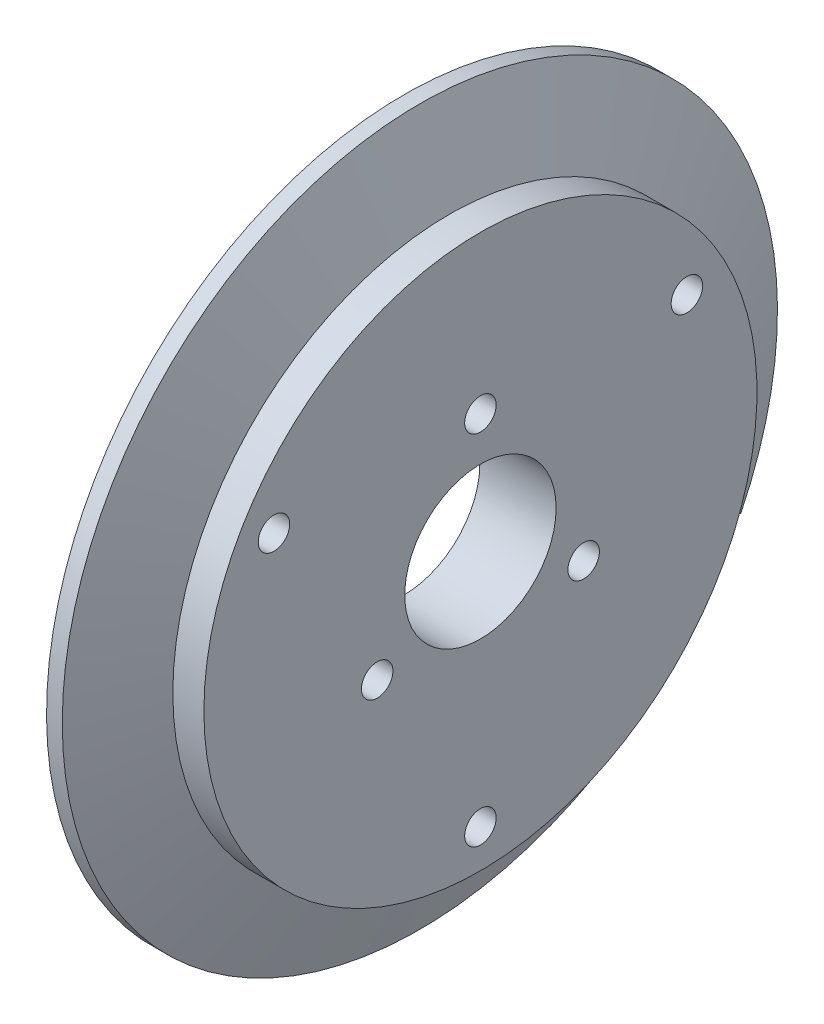
ISO-10303-21;
HEADER;
FILE_DESCRIPTION(('STEP AP214'),'2;1');
FILE_NAME('part.step','',(''),(''),'','','');
FILE_SCHEMA(('AUTOMOTIVE_DESIGN { 1 0 10303 214 1 1 1 1 }'));
ENDSEC;
DATA;
#1=APPLICATION_CONTEXT('core data for automotive mechanical design processes');
#2=APPLICATION_PROTOCOL_DEFINITION('international standard','automotive_design',2000,#1);
#3=PRODUCT_CONTEXT('',#1,'mechanical');
#4=PRODUCT('Part','Part','',(#3));
#5=PRODUCT_RELATED_PRODUCT_CATEGORY('part','',(#4));
#6=PRODUCT_DEFINITION_FORMATION('','',#4);
#7=PRODUCT_DEFINITION_CONTEXT('part definition',#1,'design');
#8=PRODUCT_DEFINITION('design','',#6,#7);
#9=PRODUCT_DEFINITION_SHAPE('','',#8);
#10=(LENGTH_UNIT() NAMED_UNIT(*) SI_UNIT(.MILLI.,.METRE.));
#11=(NAMED_UNIT(*) PLANE_ANGLE_UNIT() SI_UNIT($,.RADIAN.));
#12=(NAMED_UNIT(*) SI_UNIT($,.STERADIAN.) SOLID_ANGLE_UNIT());
#13=UNCERTAINTY_MEASURE_WITH_UNIT(LENGTH_MEASURE(1.E-05),#10,'distance_accuracy_value','');
#14=(GEOMETRIC_REPRESENTATION_CONTEXT(3) GLOBAL_UNCERTAINTY_ASSIGNED_CONTEXT((#13)) GLOBAL_UNIT_ASSIGNED_CONTEXT((#10,
#11,#12)) REPRESENTATION_CONTEXT('',''));
#15=CARTESIAN_POINT('',(0.,0.,0.));
#16=DIRECTION('',(0.,0.,1.));
#17=DIRECTION('',(1.,0.,0.));
#18=AXIS2_PLACEMENT_3D('',#15,#16,#17);
#19=CARTESIAN_POINT('',(0.,0.,0.));
#20=DIRECTION('',(1.,0.,0.));
#21=DIRECTION('',(0.,0.,-1.));
#22=AXIS2_PLACEMENT_3D('',#19,#20,#21);
#23=PLANE('',#22);
#24=CARTESIAN_POINT('',(0.,0.,0.));
#25=DIRECTION('',(1.,0.,0.));
#26=DIRECTION('',(0.,0.,-1.));
#27=AXIS2_PLACEMENT_3D('',#24,#25,#26);
#28=CIRCLE('',#27,7.94);
#29=CARTESIAN_POINT('',(0.,0.,-7.94));
#30=VERTEX_POINT('',#29);
#31=EDGE_CURVE('E144',#30,#30,#28,.T.);
#32=ORIENTED_EDGE('',*,*,#31,.T.);
#33=EDGE_LOOP('',(#32));
#34=FACE_BOUND('',#33,.T.);
#35=CARTESIAN_POINT('',(0.,12.5,0.));
#36=DIRECTION('',(1.,0.,0.));
#37=DIRECTION('',(0.,0.,-1.));
#38=AXIS2_PLACEMENT_3D('',#35,#36,#37);
#39=CIRCLE('',#38,1.65);
#40=CARTESIAN_POINT('',(0.,12.5,-1.65));
#41=VERTEX_POINT('',#40);
#42=EDGE_CURVE('E141',#41,#41,#39,.T.);
#43=ORIENTED_EDGE('',*,*,#42,.T.);
#44=EDGE_LOOP('',(#43));
#45=FACE_BOUND('',#44,.T.);
#46=CARTESIAN_POINT('',(0.,-6.25000000000005,10.8253175473055));
#47=DIRECTION('',(1.,0.,0.));
#48=DIRECTION('',(0.,0.,-1.));
#49=AXIS2_PLACEMENT_3D('',#46,#47,#48);
#50=CIRCLE('',#49,1.65);
#51=CARTESIAN_POINT('',(0.,-6.25000000000005,9.17531754730545));
#52=VERTEX_POINT('',#51);
#53=EDGE_CURVE('E135',#52,#52,#50,.T.);
#54=ORIENTED_EDGE('',*,*,#53,.T.);
#55=EDGE_LOOP('',(#54));
#56=FACE_BOUND('',#55,.T.);
#57=CARTESIAN_POINT('',(0.,-6.25000000000005,-10.8253175473055));
#58=DIRECTION('',(1.,0.,0.));
#59=DIRECTION('',(0.,0.,-1.));
#60=AXIS2_PLACEMENT_3D('',#57,#58,#59);
#61=CIRCLE('',#60,1.65);
#62=CARTESIAN_POINT('',(0.,-6.25000000000005,-12.4753175473055));
#63=VERTEX_POINT('',#62);
#64=EDGE_CURVE('E129',#63,#63,#61,.T.);
#65=ORIENTED_EDGE('',*,*,#64,.T.);
#66=EDGE_LOOP('',(#65));
#67=FACE_BOUND('',#66,.T.);
#68=CARTESIAN_POINT('',(0.,12.4999999999999,21.650635094611));
#69=DIRECTION('',(1.,0.,0.));
#70=DIRECTION('',(0.,0.,-1.));
#71=AXIS2_PLACEMENT_3D('',#68,#69,#70);
#72=CIRCLE('',#71,1.64999999999999);
#73=CARTESIAN_POINT('',(0.,12.4999999999999,20.000635094611));
#74=VERTEX_POINT('',#73);
#75=EDGE_CURVE('E123',#74,#74,#72,.T.);
#76=ORIENTED_EDGE('',*,*,#75,.T.);
#77=EDGE_LOOP('',(#76));
#78=FACE_BOUND('',#77,.T.);
#79=CARTESIAN_POINT('',(0.,12.5,-21.650635094611));
#80=DIRECTION('',(1.,0.,0.));
#81=DIRECTION('',(0.,0.,-1.));
#82=AXIS2_PLACEMENT_3D('',#79,#80,#81);
#83=CIRCLE('',#82,1.65000000000001);
#84=CARTESIAN_POINT('',(0.,12.5,-23.300635094611));
#85=VERTEX_POINT('',#84);
#86=EDGE_CURVE('E117',#85,#85,#83,.T.);
#87=ORIENTED_EDGE('',*,*,#86,.T.);
#88=EDGE_LOOP('',(#87));
#89=FACE_BOUND('',#88,.T.);
#90=CARTESIAN_POINT('',(0.,-25.,0.));
#91=DIRECTION('',(1.,0.,0.));
#92=DIRECTION('',(0.,0.,-1.));
#93=AXIS2_PLACEMENT_3D('',#90,#91,#92);
#94=CIRCLE('',#93,1.65);
#95=CARTESIAN_POINT('',(0.,-25.,-1.65));
#96=VERTEX_POINT('',#95);
#97=EDGE_CURVE('E111',#96,#96,#94,.T.);
#98=ORIENTED_EDGE('',*,*,#97,.T.);
#99=EDGE_LOOP('',(#98));
#100=FACE_BOUND('',#99,.T.);
#101=DIRECTION('',(0.,0.499999999999998,0.86602540378444));
#102=VECTOR('',#101,1.);
#103=CARTESIAN_POINT('',(0.,-40.5349364905387,-75.2085694831912));
#104=LINE('',#103,#102);
#105=CARTESIAN_POINT('',(0.,-16.5432234244085,-33.6537034920393));
#106=VERTEX_POINT('',#105);
#107=CARTESIAN_POINT('',(0.,-7.83493649053886,-18.5705080756888));
#108=VERTEX_POINT('',#107);
#109=EDGE_CURVE('E84',#106,#108,#104,.T.);
#110=ORIENTED_EDGE('',*,*,#109,.T.);
#111=DIRECTION('',(0.,0.86602540378444,-0.499999999999998));
#112=VECTOR('',#111,1.);
#113=CARTESIAN_POINT('',(0.,-12.1650635094611,-16.0705080756888));
#114=LINE('',#113,#112);
#115=CARTESIAN_POINT('',(0.,-12.1650635094611,-16.0705080756888));
#116=VERTEX_POINT('',#115);
#117=EDGE_CURVE('E91',#116,#108,#114,.T.);
#118=ORIENTED_EDGE('',*,*,#117,.F.);
#119=DIRECTION('',(0.,0.499999999999998,0.86602540378444));
#120=VECTOR('',#119,1.);
#121=CARTESIAN_POINT('',(0.,-44.8650635094609,-72.7085694831912));
#122=LINE('',#121,#120);
#123=CARTESIAN_POINT('',(0.,-20.8733504433307,-31.1537034920394));
#124=VERTEX_POINT('',#123);
#125=EDGE_CURVE('E271',#124,#116,#122,.T.);
#126=ORIENTED_EDGE('',*,*,#125,.F.);
#127=CARTESIAN_POINT('',(0.,0.,0.));
#128=DIRECTION('',(-1.,0.,0.));
#129=DIRECTION('',(0.,0.,1.));
#130=AXIS2_PLACEMENT_3D('',#127,#128,#129);
#131=CIRCLE('',#130,37.5);
#132=EDGE_CURVE('E102',#124,#106,#131,.T.);
#133=ORIENTED_EDGE('',*,*,#132,.T.);
#134=EDGE_LOOP('',(#110,#118,#126,#133));
#135=FACE_BOUND('',#134,.T.);
#136=ADVANCED_FACE('F32',(#34,#45,#56,#67,#78,#89,#100,#135),#23,.F.);
#137=CARTESIAN_POINT('',(0.,0.,0.));
#138=DIRECTION('',(-1.,0.,0.));
#139=DIRECTION('',(0.,0.,1.));
#140=AXIS2_PLACEMENT_3D('',#137,#138,#139);
#141=CYLINDRICAL_SURFACE('',#140,37.5);
#142=DIRECTION('',(-1.,0.,0.));
#143=VECTOR('',#142,1.);
#144=CARTESIAN_POINT('',(0.,-16.5432234244085,-33.6537034920393));
#145=LINE('',#144,#143);
#146=CARTESIAN_POINT('',(1.65,-16.5432234244085,-33.6537034920393));
#147=VERTEX_POINT('',#146);
#148=EDGE_CURVE('E58',#106,#147,#145,.F.);
#149=ORIENTED_EDGE('',*,*,#148,.F.);
#150=ORIENTED_EDGE('',*,*,#132,.F.);
#151=DIRECTION('',(-1.,0.,0.));
#152=VECTOR('',#151,1.);
#153=CARTESIAN_POINT('',(0.,-20.8733504433307,-31.1537034920394));
#154=LINE('',#153,#152);
#155=CARTESIAN_POINT('',(1.65,-20.8733504433307,-31.1537034920394));
#156=VERTEX_POINT('',#155);
#157=EDGE_CURVE('E103',#156,#124,#154,.T.);
#158=ORIENTED_EDGE('',*,*,#157,.F.);
#159=CARTESIAN_POINT('',(1.65,0.,0.));
#160=DIRECTION('',(-1.,0.,0.));
#161=DIRECTION('',(0.,0.,1.));
#162=AXIS2_PLACEMENT_3D('',#159,#160,#161);
#163=CIRCLE('',#162,37.5);
#164=EDGE_CURVE('E158',#156,#147,#163,.T.);
#165=ORIENTED_EDGE('',*,*,#164,.T.);
#166=EDGE_LOOP('',(#149,#150,#158,#165));
#167=FACE_BOUND('',#166,.T.);
#168=ADVANCED_FACE('F220',(#167),#141,.T.);
#169=CARTESIAN_POINT('',(4.74374699126273,0.,0.));
#170=DIRECTION('',(-1.,0.,0.));
#171=DIRECTION('',(0.,0.,1.));
#172=AXIS2_PLACEMENT_3D('',#169,#170,#171);
#173=CONICAL_SURFACE('',#172,29.,1.22173047639603);
#174=CARTESIAN_POINT('',(4.74374699126273,0.,0.));
#175=DIRECTION('',(-1.,0.,0.));
#176=DIRECTION('',(0.,0.,1.));
#177=AXIS2_PLACEMENT_3D('',#174,#175,#176);
#178=CIRCLE('',#177,29.);
#179=CARTESIAN_POINT('',(4.74374699126273,0.,29.));
#180=VERTEX_POINT('',#179);
#181=EDGE_CURVE('E155',#180,#180,#178,.T.);
#182=ORIENTED_EDGE('',*,*,#181,.T.);
#183=EDGE_LOOP('',(#182));
#184=FACE_BOUND('',#183,.T.);
#185=CARTESIAN_POINT('',(-8.8275723793234,-30.9548030849081,-58.6152916813509));
#186=CARTESIAN_POINT('',(-8.31446972955865,-30.2494314987137,-57.3935522558468));
#187=CARTESIAN_POINT('',(-7.80138672173942,-29.5440563402964,-56.1718066430711));
#188=CARTESIAN_POINT('',(-6.77526066960312,-28.133282469021,-53.7282746200315));
#189=CARTESIAN_POINT('',(-6.26221762631444,-27.427883755976,-52.5064882094438));
#190=CARTESIAN_POINT('',(-5.23365679063651,-26.0135876322605,-50.0568554662208));
#191=CARTESIAN_POINT('',(-4.71813930340929,-25.3046901661063,-48.8290090374849));
#192=CARTESIAN_POINT('',(-3.68719321070832,-23.8868954942907,-46.3733166311998));
#193=CARTESIAN_POINT('',(-3.17176460363213,-23.1779982889206,-45.1454706541552));
#194=CARTESIAN_POINT('',(-2.09033687634009,-21.6904879643889,-42.569027195283));
#195=CARTESIAN_POINT('',(-1.52434808066987,-20.9118729686823,-41.2204264631841));
#196=CARTESIAN_POINT('',(-0.392496825408512,-19.3545641044236,-38.5230883872106));
#197=CARTESIAN_POINT('',(0.173365623890607,-18.5758702340013,-37.1743510400968));
#198=CARTESIAN_POINT('',(1.30195389490881,-17.0224485071333,-34.48374568358));
#199=CARTESIAN_POINT('',(1.86468087393878,-16.2477208609,-33.1418780382757));
#200=CARTESIAN_POINT('',(2.98968130018019,-14.6983890380062,-30.4583566032404));
#201=CARTESIAN_POINT('',(3.5519548228383,-13.9237848750427,-29.1167028372331));
#202=CARTESIAN_POINT('',(4.59290286817615,-12.4890390951529,-26.6316502505189));
#203=CARTESIAN_POINT('',(5.07164433984478,-11.8289096233568,-25.4882724657945));
#204=CARTESIAN_POINT('',(6.02898525084169,-10.5080070416188,-23.2004020823754));
#205=CARTESIAN_POINT('',(6.50758424499138,-9.84723385101026,-22.055909343962));
#206=CARTESIAN_POINT('',(7.47180627175397,-8.5146487896143,-19.7478043122169));
#207=CARTESIAN_POINT('',(7.9574151609319,-7.84283435879329,-18.584187584777));
#208=CARTESIAN_POINT('',(8.6839159015045,-6.8358982701514,-16.8401231192745));
#209=CARTESIAN_POINT('',(8.92540434057852,-6.50088424168883,-16.259861800729));
#210=CARTESIAN_POINT('',(9.40779440466214,-5.83079084317275,-15.0992259886827));
#211=CARTESIAN_POINT('',(9.64869608941121,-5.49571148387354,-14.5188515138088));
#212=CARTESIAN_POINT('',(10.113591811622,-4.84783679275167,-13.3966996318477));
#213=CARTESIAN_POINT('',(10.3376384134174,-4.53505089620791,-12.8549385671429));
#214=CARTESIAN_POINT('',(10.7847616764036,-3.90916882746776,-11.7708790245387));
#215=CARTESIAN_POINT('',(11.007837927177,-3.59607258195171,-11.2285804196458));
#216=CARTESIAN_POINT('',(11.4549169044161,-2.96596104454716,-10.1371952224258));
#217=CARTESIAN_POINT('',(11.6789004599262,-2.6489423440398,-9.58810272619759));
#218=CARTESIAN_POINT('',(12.0125124680909,-2.17325577179811,-8.76418941459669));
#219=CARTESIAN_POINT('',(12.1232436667838,-2.01478137485388,-8.48970370739045));
#220=CARTESIAN_POINT('',(12.3436899817237,-1.6976561496558,-7.94042670498564));
#221=CARTESIAN_POINT('',(12.4534050998511,-1.53900532172906,-7.66563541035366));
#222=CARTESIAN_POINT('',(12.667346255247,-1.22737502023325,-7.1258758949849));
#223=CARTESIAN_POINT('',(12.7716244824056,-1.07440452232944,-6.86092322055641));
#224=CARTESIAN_POINT('',(12.9782643988866,-0.768138223713688,-6.33045443070786));
#225=CARTESIAN_POINT('',(13.0806260703921,-0.614842419992336,-6.06493831007536));
#226=CARTESIAN_POINT('',(13.2830281548528,-0.306928673309447,-5.5316160564717));
#227=CARTESIAN_POINT('',(13.3830526750399,-0.152308098896462,-5.26380536569294));
#228=CARTESIAN_POINT('',(13.5295602595354,0.0801800804788776,-4.86112402685566));
#229=CARTESIAN_POINT('',(13.5778080505104,0.157769242283406,-4.72673565649353));
#230=CARTESIAN_POINT('',(13.6727604340594,0.313182827408092,-4.45755143087114));
#231=CARTESIAN_POINT('',(13.7194650492743,0.391007247258334,-4.32275558162095));
#232=CARTESIAN_POINT('',(13.8098198251066,0.545198731008753,-4.05568809767079));
#233=CARTESIAN_POINT('',(13.8535150783767,0.621559161806611,-3.92342795184106));
#234=CARTESIAN_POINT('',(13.9383335551399,0.774639263549616,-3.65828543799436));
#235=CARTESIAN_POINT('',(13.9794567554884,0.851358937720731,-3.52540306438986));
#236=CARTESIAN_POINT('',(14.05827404238,1.00530204011147,-3.25876578957431));
#237=CARTESIAN_POINT('',(14.0959655623124,1.08252579982915,-3.12501031419178));
#238=CARTESIAN_POINT('',(14.1666627993073,1.23751735452384,-2.8565570667165));
#239=CARTESIAN_POINT('',(14.1996683862727,1.3152851645426,-2.72185926857065));
#240=CARTESIAN_POINT('',(14.2591023952407,1.47071480116494,-2.4526472409388));
#241=CARTESIAN_POINT('',(14.2855886762605,1.54837098883087,-2.31814277837928));
#242=CARTESIAN_POINT('',(14.3305004797512,1.7042762203737,-2.04810699618131));
#243=CARTESIAN_POINT('',(14.3489264883255,1.78252522820885,-1.91257573896899));
#244=CARTESIAN_POINT('',(14.3758908922447,1.93929115621144,-1.64104918677281));
#245=CARTESIAN_POINT('',(14.3844505451758,2.0178071334553,-1.50505552498053));
#246=CARTESIAN_POINT('',(14.3907199696699,2.17493404092078,-1.23290373801414));
#247=CARTESIAN_POINT('',(14.3884333670067,2.25354493063018,-1.09674568300925));
#248=CARTESIAN_POINT('',(14.3788053987816,2.35354341300161,-0.923543230862164));
#249=CARTESIAN_POINT('',(14.3763350898824,2.37506779755481,-0.886261903214368));
#250=CARTESIAN_POINT('',(14.3706291339643,2.41810238278785,-0.811723815108104));
#251=CARTESIAN_POINT('',(14.3673931109524,2.43961257127687,-0.774467075764735));
#252=CARTESIAN_POINT('',(14.3565678253939,2.50414014951856,-0.662702031760737));
#253=CARTESIAN_POINT('',(14.3478655796217,2.54711161453185,-0.58827327108204));
#254=CARTESIAN_POINT('',(14.3277568715979,2.63294075447817,-0.439612839925074));
#255=CARTESIAN_POINT('',(14.3163475021519,2.67579825664283,-0.365381468690391));
#256=CARTESIAN_POINT('',(14.2911403727055,2.7613226519318,-0.217248870763302));
#257=CARTESIAN_POINT('',(14.277343323735,2.80398959793288,-0.143347552485642));
#258=CARTESIAN_POINT('',(14.2327860184206,2.93187316308032,0.0781532798027739));
#259=CARTESIAN_POINT('',(14.1988981125224,3.01681769695388,0.225281528297036));
#260=CARTESIAN_POINT('',(14.1250545968029,3.18602091579569,0.518350100135264));
#261=CARTESIAN_POINT('',(14.0850994001906,3.27027964705868,0.664290503664059));
#262=CARTESIAN_POINT('',(14.000616966875,3.4386547469455,0.955924731397503));
#263=CARTESIAN_POINT('',(13.956068350571,3.52276840975568,1.10161386899545));
#264=CARTESIAN_POINT('',(13.8637887458833,3.69055057206556,1.39222109871994));
#265=CARTESIAN_POINT('',(13.8160578934683,3.77421909042039,1.53713922350453));
#266=CARTESIAN_POINT('',(13.7183665120087,3.94105573579508,1.82610876985785));
#267=CARTESIAN_POINT('',(13.6684103856478,4.02422451105977,1.97016131421955));
#268=CARTESIAN_POINT('',(13.5667401422727,4.19028932126195,2.25779400283899));
#269=CARTESIAN_POINT('',(13.5150261065334,4.27318536861486,2.40137416860086));
#270=CARTESIAN_POINT('',(13.462708598093,4.35598284570649,2.54478360566209));
#271=B_SPLINE_CURVE_WITH_KNOTS('',3,(#185,#186,#187,#188,#189,#190,#191,#192,#193,#194,#195,
#196,#197,#198,#199,#200,#201,#202,#203,#204,#205,#206,#207,#208,#209,#210,#211,#212,#213,#214,
#215,#216,#217,#218,#219,#220,#221,#222,#223,#224,#225,#226,#227,#228,#229,#230,#231,#232,#233,
#234,#235,#236,#237,#238,#239,#240,#241,#242,#243,#244,#245,#246,#247,#248,#249,#250,#251,#252,
#253,#254,#255,#256,#257,#258,#259,#260,#261,#262,#263,#264,#265,#266,#267,#268,#269,#270),
.UNSPECIFIED.,.F.,.F.,(4,2,2,2,2,2,2,2,2,2,2,2,2,2,2,2,2,2,2,2,2,2,2,2,2,2,2,2,2,2,2,2,2,2,2,2,
2,2,2,2,2,2,4),(0.,4.50346929079899,9.00703042243521,13.5328570574977,18.0585911124506,
23.0292829156109,28.0002900431737,32.9457182322975,37.8899857278246,42.1031191157398,
46.3197380851206,50.6058067730177,52.7424601458648,54.8788860337746,56.8723327328204,
58.866553501968,60.8838606779495,61.8910642282244,62.8982659141455,63.867933669739,
64.837610435213,65.8126286922797,66.3001405219645,66.7876451958876,67.2641750572769,
67.7407092060907,68.2175968841525,68.6944977996013,69.166999826173,69.6394733529036,
70.1109269962865,70.5822230494509,70.7115784885882,70.840997578151,71.1000935476051,
71.3594690310833,71.6187674073162,72.1382990556333,72.6577953374347,73.1798291902141,
73.7018407521282,74.2228617934228,74.7438587786185),.UNSPECIFIED.);
#272=CARTESIAN_POINT('',(2.,-16.0613145260962,-32.8190127955428));
#273=VERTEX_POINT('',#272);
#274=EDGE_CURVE('E11',#147,#273,#271,.T.);
#275=ORIENTED_EDGE('',*,*,#274,.F.);
#276=ORIENTED_EDGE('',*,*,#164,.F.);
#277=CARTESIAN_POINT('',(13.8800327516613,-0.669533486915,3.84033398329447));
#278=CARTESIAN_POINT('',(13.9181248466515,-0.737798323284927,3.72209581833139));
#279=CARTESIAN_POINT('',(13.9552895025572,-0.80620019842367,3.60362029525811));
#280=CARTESIAN_POINT('',(14.0270299357118,-0.943377513899891,3.36602221520738));
#281=CARTESIAN_POINT('',(14.0616044200523,-1.01215312266068,3.24689936651221));
#282=CARTESIAN_POINT('',(14.1276572444872,-1.15066764122823,3.00698518276726));
#283=CARTESIAN_POINT('',(14.1591082853087,-1.22040984337177,2.88618814522291));
#284=CARTESIAN_POINT('',(14.2175167796332,-1.36036152577541,2.64378472069506));
#285=CARTESIAN_POINT('',(14.244474734636,-1.43057095297485,2.52217842561533));
#286=CARTESIAN_POINT('',(14.2915938132783,-1.56855397592199,2.28318481928894));
#287=CARTESIAN_POINT('',(14.3119915282593,-1.63630702899612,2.16583308899664));
#288=CARTESIAN_POINT('',(14.3462114263407,-1.77223417961751,1.9304003579923));
#289=CARTESIAN_POINT('',(14.3600338721431,-1.84040826023319,1.81231938660664));
#290=CARTESIAN_POINT('',(14.3799655995868,-1.9767342937995,1.57619577007546));
#291=CARTESIAN_POINT('',(14.3861096045952,-2.0448849427797,1.45815538347298));
#292=CARTESIAN_POINT('',(14.3902328252852,-2.18124310927479,1.22197611107655));
#293=CARTESIAN_POINT('',(14.3882129649864,-2.24945061948024,1.10383723794292));
#294=CARTESIAN_POINT('',(14.3770145348056,-2.37654677177008,0.883700244730416));
#295=CARTESIAN_POINT('',(14.3688323049525,-2.43545847138552,0.781662187836234));
#296=CARTESIAN_POINT('',(14.3470371955009,-2.55303496835207,0.578013721314203));
#297=CARTESIAN_POINT('',(14.3334235034022,-2.61169972743557,0.476403377967799));
#298=CARTESIAN_POINT('',(14.3014992394545,-2.72875727861502,0.273653751915405));
#299=CARTESIAN_POINT('',(14.283184441827,-2.78714977764509,0.172514976814394));
#300=CARTESIAN_POINT('',(14.2426658648409,-2.90359096094978,-0.0291670687627775));
#301=CARTESIAN_POINT('',(14.2204621613076,-2.9616396519051,-0.129710350810261));
#302=CARTESIAN_POINT('',(14.1727471613154,-3.07779531224786,-0.330897856110649));
#303=CARTESIAN_POINT('',(14.1472148581922,-3.13590010376929,-0.431538307188945));
#304=CARTESIAN_POINT('',(14.0935910598118,-3.25181509458673,-0.632308960643642));
#305=CARTESIAN_POINT('',(14.0654994067331,-3.30962527548325,-0.732439131151149));
#306=CARTESIAN_POINT('',(13.9782183430565,-3.48261937915603,-1.03207370812225));
#307=CARTESIAN_POINT('',(13.9159999470235,-3.59741999692224,-1.23091421083363));
#308=CARTESIAN_POINT('',(13.7848778960361,-3.82899111203192,-1.63200714776898));
#309=CARTESIAN_POINT('',(13.7158507307617,-3.94574379723715,-1.83422873046453));
#310=CARTESIAN_POINT('',(13.5742365026275,-4.17871094356853,-2.23773966440481));
#311=CARTESIAN_POINT('',(13.5016492919662,-4.29492538212886,-2.43902897656438));
#312=CARTESIAN_POINT('',(13.3543248860135,-4.52654146623915,-2.84019980209357));
#313=CARTESIAN_POINT('',(13.2795965593017,-4.64194452945183,-3.040083770927));
#314=CARTESIAN_POINT('',(13.1284433415423,-4.87246920096191,-3.4393642143806));
#315=CARTESIAN_POINT('',(13.0520184862204,-4.98759081512952,-3.63876069916824));
#316=CARTESIAN_POINT('',(12.8848632077371,-5.2371448700918,-4.07100100159774));
#317=CARTESIAN_POINT('',(12.7939059135439,-5.37153925567983,-4.30377890568821));
#318=CARTESIAN_POINT('',(12.6107875321295,-5.64012304230343,-4.76897967020953));
#319=CARTESIAN_POINT('',(12.5186264402424,-5.77431244254226,-5.00140252926038));
#320=CARTESIAN_POINT('',(12.2408329603037,-6.17665823066907,-5.69828587650737));
#321=CARTESIAN_POINT('',(12.0538927438792,-6.44458869087177,-6.16235504647373));
#322=CARTESIAN_POINT('',(11.6779948685343,-6.98010871885599,-7.08990294341312));
#323=CARTESIAN_POINT('',(11.4890371139566,-7.24769826979469,-7.5533816412135));
#324=CARTESIAN_POINT('',(11.1098378652987,-7.7826474076143,-8.47994072738224));
#325=CARTESIAN_POINT('',(10.9195963813569,-8.05000699629261,-8.94302111886377));
#326=CARTESIAN_POINT('',(10.5379823048394,-8.58495419555034,-9.86957684734486));
#327=CARTESIAN_POINT('',(10.3466084856771,-8.85254158718603,-10.3330518051227));
#328=CARTESIAN_POINT('',(9.96325269692037,-9.38760800702452,-11.259814029707));
#329=CARTESIAN_POINT('',(9.77127072611891,-9.65508703501107,-11.7231012961388));
#330=CARTESIAN_POINT('',(9.19468278416125,-10.4573932592544,-13.1127364397571));
#331=CARTESIAN_POINT('',(8.80942497559308,-10.9921033131635,-14.0388814204454));
#332=CARTESIAN_POINT('',(8.04419651514756,-12.0526459755696,-15.8757951953273));
#333=CARTESIAN_POINT('',(7.66424183126965,-12.5784814668409,-16.786568982632));
#334=CARTESIAN_POINT('',(6.90371539865151,-13.6300448142867,-18.6079301277855));
#335=CARTESIAN_POINT('',(6.52314364583321,-14.1557726697239,-19.5185174843569));
#336=CARTESIAN_POINT('',(5.7617504253982,-15.2069299665951,-21.3391753292846));
#337=CARTESIAN_POINT('',(5.38092913308989,-15.7323594397816,-22.2492458726377));
#338=CARTESIAN_POINT('',(4.61899644144797,-16.7831646656706,-24.0692939127364));
#339=CARTESIAN_POINT('',(4.23788504266621,-17.3085404184733,-24.9792714096553));
#340=CARTESIAN_POINT('',(3.31191595989788,-18.584622268314,-27.1895100081959));
#341=CARTESIAN_POINT('',(2.76694833458527,-19.3353084198965,-28.4897365632752));
#342=CARTESIAN_POINT('',(1.67672401679049,-20.836628732149,-31.0900996225318));
#343=CARTESIAN_POINT('',(1.13146732414082,-21.5872628927887,-32.3902361266566));
#344=CARTESIAN_POINT('',(-0.504775067040297,-23.8393476618993,-36.2909613697081));
#345=CARTESIAN_POINT('',(-1.59606114071008,-25.3407437092891,-38.8914556060703));
#346=CARTESIAN_POINT('',(-3.80133020586414,-28.3740882577174,-44.1453624808103));
#347=CARTESIAN_POINT('',(-4.91532202645193,-29.9060351538043,-46.7987723393302));
#348=CARTESIAN_POINT('',(-7.14341521438626,-32.9696308045292,-52.1050756602329));
#349=CARTESIAN_POINT('',(-8.25751653549719,-34.5012795675736,-54.7579691371758));
#350=CARTESIAN_POINT('',(-9.37168308539007,-36.032916463105,-57.4108420589833));
#351=B_SPLINE_CURVE_WITH_KNOTS('',3,(#277,#278,#279,#280,#281,#282,#283,#284,#285,#286,#287,
#288,#289,#290,#291,#292,#293,#294,#295,#296,#297,#298,#299,#300,#301,#302,#303,#304,#305,#306,
#307,#308,#309,#310,#311,#312,#313,#314,#315,#316,#317,#318,#319,#320,#321,#322,#323,#324,#325,
#326,#327,#328,#329,#330,#331,#332,#333,#334,#335,#336,#337,#338,#339,#340,#341,#342,#343,#344,
#345,#346,#347,#348,#349,#350),.UNSPECIFIED.,.F.,.F.,(4,2,2,2,2,2,2,2,2,2,2,2,2,2,2,2,2,2,2,2,2,
2,2,2,2,2,2,2,2,2,2,2,2,2,2,2,4),(0.,0.425250957693079,0.850712788289778,1.27961528193183,
1.70846987113711,2.11943741544868,2.53038853897442,2.93947445866464,3.34851407762963,
3.70269966118618,4.05693824774556,4.41149637791795,4.76604759574029,5.12295576405377,
5.47988595593766,6.19342044382983,6.92386897170938,7.65434785113274,8.38214574612995,
9.10992832963055,9.96120898364911,10.8124929380923,12.5150831089088,14.2177543661351,
15.9204121920311,17.6254993889332,19.3305899720289,22.7406837328013,26.0952918215277,
29.449922171186,32.8031242359375,36.1563199379115,40.947976863231,45.7396365682249,
55.3244677850603,65.1048464225764,74.8836562176292),.UNSPECIFIED.);
#352=CARTESIAN_POINT('',(2.,-20.3914415450184,-30.3190127955428));
#353=VERTEX_POINT('',#352);
#354=EDGE_CURVE('E162',#353,#156,#351,.T.);
#355=ORIENTED_EDGE('',*,*,#354,.F.);
#356=CARTESIAN_POINT('',(2.,0.,0.));
#357=DIRECTION('',(-1.,0.,0.));
#358=DIRECTION('',(0.,0.,1.));
#359=AXIS2_PLACEMENT_3D('',#356,#357,#358);
#360=CIRCLE('',#359,36.5383829031909);
#361=EDGE_CURVE('E44',#273,#353,#360,.T.);
#362=ORIENTED_EDGE('',*,*,#361,.F.);
#363=EDGE_LOOP('',(#275,#276,#355,#362));
#364=FACE_BOUND('',#363,.T.);
#365=ADVANCED_FACE('F167',(#184,#364),#173,.T.);
#366=CARTESIAN_POINT('',(8.,29.,0.));
#367=DIRECTION('',(-1.,0.,0.));
#368=DIRECTION('',(0.,0.,1.));
#369=AXIS2_PLACEMENT_3D('',#366,#367,#368);
#370=PLANE('',#369);
#371=CARTESIAN_POINT('',(8.,-25.,0.));
#372=DIRECTION('',(1.,0.,0.));
#373=DIRECTION('',(0.,0.,-1.));
#374=AXIS2_PLACEMENT_3D('',#371,#372,#373);
#375=CIRCLE('',#374,1.65);
#376=CARTESIAN_POINT('',(8.,-25.,-1.65));
#377=VERTEX_POINT('',#376);
#378=EDGE_CURVE('E110',#377,#377,#375,.T.);
#379=ORIENTED_EDGE('',*,*,#378,.F.);
#380=EDGE_LOOP('',(#379));
#381=FACE_BOUND('',#380,.T.);
#382=CARTESIAN_POINT('',(8.,12.5,-21.650635094611));
#383=DIRECTION('',(1.,0.,0.));
#384=DIRECTION('',(0.,0.,-1.));
#385=AXIS2_PLACEMENT_3D('',#382,#383,#384);
#386=CIRCLE('',#385,1.65000000000001);
#387=CARTESIAN_POINT('',(8.,12.5,-23.300635094611));
#388=VERTEX_POINT('',#387);
#389=EDGE_CURVE('E114',#388,#388,#386,.T.);
#390=ORIENTED_EDGE('',*,*,#389,.F.);
#391=EDGE_LOOP('',(#390));
#392=FACE_BOUND('',#391,.T.);
#393=CARTESIAN_POINT('',(8.,12.4999999999999,21.650635094611));
#394=DIRECTION('',(1.,0.,0.));
#395=DIRECTION('',(0.,0.,-1.));
#396=AXIS2_PLACEMENT_3D('',#393,#394,#395);
#397=CIRCLE('',#396,1.64999999999999);
#398=CARTESIAN_POINT('',(8.,12.4999999999999,20.000635094611));
#399=VERTEX_POINT('',#398);
#400=EDGE_CURVE('E120',#399,#399,#397,.T.);
#401=ORIENTED_EDGE('',*,*,#400,.F.);
#402=EDGE_LOOP('',(#401));
#403=FACE_BOUND('',#402,.T.);
#404=CARTESIAN_POINT('',(8.,-6.25000000000005,-10.8253175473055));
#405=DIRECTION('',(1.,0.,0.));
#406=DIRECTION('',(0.,0.,-1.));
#407=AXIS2_PLACEMENT_3D('',#404,#405,#406);
#408=CIRCLE('',#407,1.65);
#409=CARTESIAN_POINT('',(8.,-6.25000000000005,-12.4753175473055));
#410=VERTEX_POINT('',#409);
#411=EDGE_CURVE('E126',#410,#410,#408,.T.);
#412=ORIENTED_EDGE('',*,*,#411,.F.);
#413=EDGE_LOOP('',(#412));
#414=FACE_BOUND('',#413,.T.);
#415=CARTESIAN_POINT('',(8.,-6.25000000000005,10.8253175473055));
#416=DIRECTION('',(1.,0.,0.));
#417=DIRECTION('',(0.,0.,-1.));
#418=AXIS2_PLACEMENT_3D('',#415,#416,#417);
#419=CIRCLE('',#418,1.65);
#420=CARTESIAN_POINT('',(8.,-6.25000000000005,9.17531754730545));
#421=VERTEX_POINT('',#420);
#422=EDGE_CURVE('E132',#421,#421,#419,.T.);
#423=ORIENTED_EDGE('',*,*,#422,.F.);
#424=EDGE_LOOP('',(#423));
#425=FACE_BOUND('',#424,.T.);
#426=CARTESIAN_POINT('',(8.,12.5,0.));
#427=DIRECTION('',(1.,0.,0.));
#428=DIRECTION('',(0.,0.,-1.));
#429=AXIS2_PLACEMENT_3D('',#426,#427,#428);
#430=CIRCLE('',#429,1.65);
#431=CARTESIAN_POINT('',(8.,12.5,-1.65));
#432=VERTEX_POINT('',#431);
#433=EDGE_CURVE('E138',#432,#432,#430,.T.);
#434=ORIENTED_EDGE('',*,*,#433,.F.);
#435=EDGE_LOOP('',(#434));
#436=FACE_BOUND('',#435,.T.);
#437=CARTESIAN_POINT('',(7.99999999999999,0.,0.));
#438=DIRECTION('',(-1.,0.,0.));
#439=DIRECTION('',(0.,0.,1.));
#440=AXIS2_PLACEMENT_3D('',#437,#438,#439);
#441=CIRCLE('',#440,29.);
#442=CARTESIAN_POINT('',(7.99999999999999,0.,29.));
#443=VERTEX_POINT('',#442);
#444=EDGE_CURVE('E150',#443,#443,#441,.T.);
#445=ORIENTED_EDGE('',*,*,#444,.F.);
#446=EDGE_LOOP('',(#445));
#447=FACE_BOUND('',#446,.T.);
#448=CARTESIAN_POINT('',(7.99999999999999,0.,0.));
#449=DIRECTION('',(1.,0.,0.));
#450=DIRECTION('',(0.,0.,-1.));
#451=AXIS2_PLACEMENT_3D('',#448,#449,#450);
#452=CIRCLE('',#451,7.94);
#453=CARTESIAN_POINT('',(7.99999999999999,0.,-7.94));
#454=VERTEX_POINT('',#453);
#455=EDGE_CURVE('E147',#454,#454,#452,.T.);
#456=ORIENTED_EDGE('',*,*,#455,.F.);
#457=EDGE_LOOP('',(#456));
#458=FACE_BOUND('',#457,.T.);
#459=ADVANCED_FACE('F210',(#381,#392,#403,#414,#425,#436,#447,#458),#370,.F.);
#460=CARTESIAN_POINT('',(0.,0.,0.));
#461=DIRECTION('',(-1.,0.,0.));
#462=DIRECTION('',(0.,0.,1.));
#463=AXIS2_PLACEMENT_3D('',#460,#461,#462);
#464=CYLINDRICAL_SURFACE('',#463,29.);
#465=ORIENTED_EDGE('',*,*,#181,.F.);
#466=EDGE_LOOP('',(#465));
#467=FACE_BOUND('',#466,.T.);
#468=ORIENTED_EDGE('',*,*,#444,.T.);
#469=EDGE_LOOP('',(#468));
#470=FACE_BOUND('',#469,.T.);
#471=ADVANCED_FACE('F208',(#467,#470),#464,.T.);
#472=CARTESIAN_POINT('',(7.99999999999999,0.,0.));
#473=DIRECTION('',(-1.,0.,0.));
#474=DIRECTION('',(0.,0.,1.));
#475=AXIS2_PLACEMENT_3D('',#472,#473,#474);
#476=CYLINDRICAL_SURFACE('',#475,7.94);
#477=ORIENTED_EDGE('',*,*,#455,.T.);
#478=EDGE_LOOP('',(#477));
#479=FACE_BOUND('',#478,.T.);
#480=ORIENTED_EDGE('',*,*,#31,.F.);
#481=EDGE_LOOP('',(#480));
#482=FACE_BOUND('',#481,.T.);
#483=ADVANCED_FACE('F204',(#479,#482),#476,.F.);
#484=CARTESIAN_POINT('',(0.,12.5,0.));
#485=DIRECTION('',(1.,0.,0.));
#486=DIRECTION('',(0.,0.,-1.));
#487=AXIS2_PLACEMENT_3D('',#484,#485,#486);
#488=CYLINDRICAL_SURFACE('',#487,1.65);
#489=ORIENTED_EDGE('',*,*,#42,.F.);
#490=EDGE_LOOP('',(#489));
#491=FACE_BOUND('',#490,.T.);
#492=ORIENTED_EDGE('',*,*,#433,.T.);
#493=EDGE_LOOP('',(#492));
#494=FACE_BOUND('',#493,.T.);
#495=ADVANCED_FACE('F200',(#491,#494),#488,.F.);
#496=CARTESIAN_POINT('',(0.,-6.25000000000005,10.8253175473055));
#497=DIRECTION('',(1.,0.,0.));
#498=DIRECTION('',(0.,0.,-1.));
#499=AXIS2_PLACEMENT_3D('',#496,#497,#498);
#500=CYLINDRICAL_SURFACE('',#499,1.65);
#501=ORIENTED_EDGE('',*,*,#53,.F.);
#502=EDGE_LOOP('',(#501));
#503=FACE_BOUND('',#502,.T.);
#504=ORIENTED_EDGE('',*,*,#422,.T.);
#505=EDGE_LOOP('',(#504));
#506=FACE_BOUND('',#505,.T.);
#507=ADVANCED_FACE('F196',(#503,#506),#500,.F.);
#508=CARTESIAN_POINT('',(0.,-6.25000000000005,-10.8253175473055));
#509=DIRECTION('',(1.,0.,0.));
#510=DIRECTION('',(0.,0.,-1.));
#511=AXIS2_PLACEMENT_3D('',#508,#509,#510);
#512=CYLINDRICAL_SURFACE('',#511,1.65);
#513=ORIENTED_EDGE('',*,*,#64,.F.);
#514=EDGE_LOOP('',(#513));
#515=FACE_BOUND('',#514,.T.);
#516=ORIENTED_EDGE('',*,*,#411,.T.);
#517=EDGE_LOOP('',(#516));
#518=FACE_BOUND('',#517,.T.);
#519=ADVANCED_FACE('F192',(#515,#518),#512,.F.);
#520=CARTESIAN_POINT('',(0.,12.4999999999999,21.650635094611));
#521=DIRECTION('',(1.,0.,0.));
#522=DIRECTION('',(0.,0.,-1.));
#523=AXIS2_PLACEMENT_3D('',#520,#521,#522);
#524=CYLINDRICAL_SURFACE('',#523,1.64999999999999);
#525=ORIENTED_EDGE('',*,*,#75,.F.);
#526=EDGE_LOOP('',(#525));
#527=FACE_BOUND('',#526,.T.);
#528=ORIENTED_EDGE('',*,*,#400,.T.);
#529=EDGE_LOOP('',(#528));
#530=FACE_BOUND('',#529,.T.);
#531=ADVANCED_FACE('F188',(#527,#530),#524,.F.);
#532=CARTESIAN_POINT('',(0.,12.5,-21.650635094611));
#533=DIRECTION('',(1.,0.,0.));
#534=DIRECTION('',(0.,0.,-1.));
#535=AXIS2_PLACEMENT_3D('',#532,#533,#534);
#536=CYLINDRICAL_SURFACE('',#535,1.65000000000001);
#537=ORIENTED_EDGE('',*,*,#86,.F.);
#538=EDGE_LOOP('',(#537));
#539=FACE_BOUND('',#538,.T.);
#540=ORIENTED_EDGE('',*,*,#389,.T.);
#541=EDGE_LOOP('',(#540));
#542=FACE_BOUND('',#541,.T.);
#543=ADVANCED_FACE('F184',(#539,#542),#536,.F.);
#544=CARTESIAN_POINT('',(0.,-25.,0.));
#545=DIRECTION('',(1.,0.,0.));
#546=DIRECTION('',(0.,0.,-1.));
#547=AXIS2_PLACEMENT_3D('',#544,#545,#546);
#548=CYLINDRICAL_SURFACE('',#547,1.65);
#549=ORIENTED_EDGE('',*,*,#97,.F.);
#550=EDGE_LOOP('',(#549));
#551=FACE_BOUND('',#550,.T.);
#552=ORIENTED_EDGE('',*,*,#378,.T.);
#553=EDGE_LOOP('',(#552));
#554=FACE_BOUND('',#553,.T.);
#555=ADVANCED_FACE('F181',(#551,#554),#548,.F.);
#556=CARTESIAN_POINT('',(0.,-40.5349364905387,-75.2085694831912));
#557=DIRECTION('',(0.,-0.86602540378444,0.499999999999998));
#558=DIRECTION('',(0.,-0.499999999999998,-0.86602540378444));
#559=AXIS2_PLACEMENT_3D('',#556,#557,#558);
#560=PLANE('',#559);
#561=ORIENTED_EDGE('',*,*,#148,.T.);
#562=ORIENTED_EDGE('',*,*,#274,.T.);
#563=DIRECTION('',(0.,0.499999999999998,0.86602540378444));
#564=VECTOR('',#563,1.);
#565=CARTESIAN_POINT('',(2.,-40.5349364905387,-75.2085694831912));
#566=LINE('',#565,#564);
#567=CARTESIAN_POINT('',(2.,-7.83493649053886,-18.5705080756888));
#568=VERTEX_POINT('',#567);
#569=EDGE_CURVE('E86',#273,#568,#566,.T.);
#570=ORIENTED_EDGE('',*,*,#569,.T.);
#571=DIRECTION('',(1.,0.,0.));
#572=VECTOR('',#571,1.);
#573=CARTESIAN_POINT('',(0.,-7.83493649053886,-18.5705080756888));
#574=LINE('',#573,#572);
#575=EDGE_CURVE('E80',#108,#568,#574,.T.);
#576=ORIENTED_EDGE('',*,*,#575,.F.);
#577=ORIENTED_EDGE('',*,*,#109,.F.);
#578=EDGE_LOOP('',(#561,#562,#570,#576,#577));
#579=FACE_BOUND('',#578,.T.);
#580=ADVANCED_FACE('F82',(#579),#560,.T.);
#581=CARTESIAN_POINT('',(2.,-44.8650635094609,-72.7085694831912));
#582=DIRECTION('',(-1.,0.,0.));
#583=DIRECTION('',(0.,0.,1.));
#584=AXIS2_PLACEMENT_3D('',#581,#582,#583);
#585=PLANE('',#584);
#586=ORIENTED_EDGE('',*,*,#361,.T.);
#587=DIRECTION('',(0.,0.499999999999998,0.86602540378444));
#588=VECTOR('',#587,1.);
#589=CARTESIAN_POINT('',(2.,-44.8650635094609,-72.7085694831912));
#590=LINE('',#589,#588);
#591=CARTESIAN_POINT('',(2.,-12.1650635094611,-16.0705080756888));
#592=VERTEX_POINT('',#591);
#593=EDGE_CURVE('E51',#353,#592,#590,.T.);
#594=ORIENTED_EDGE('',*,*,#593,.T.);
#595=DIRECTION('',(0.,-0.86602540378444,0.499999999999998));
#596=VECTOR('',#595,1.);
#597=CARTESIAN_POINT('',(2.,-12.1650635094611,-16.0705080756888));
#598=LINE('',#597,#596);
#599=EDGE_CURVE('E90',#568,#592,#598,.T.);
#600=ORIENTED_EDGE('',*,*,#599,.F.);
#601=ORIENTED_EDGE('',*,*,#569,.F.);
#602=EDGE_LOOP('',(#586,#594,#600,#601));
#603=FACE_BOUND('',#602,.T.);
#604=ADVANCED_FACE('F175',(#603),#585,.T.);
#605=CARTESIAN_POINT('',(0.,-44.8650635094609,-72.7085694831912));
#606=DIRECTION('',(0.,0.86602540378444,-0.499999999999998));
#607=DIRECTION('',(0.,0.499999999999998,0.86602540378444));
#608=AXIS2_PLACEMENT_3D('',#605,#606,#607);
#609=PLANE('',#608);
#610=ORIENTED_EDGE('',*,*,#157,.T.);
#611=ORIENTED_EDGE('',*,*,#125,.T.);
#612=DIRECTION('',(-1.,0.,0.));
#613=VECTOR('',#612,1.);
#614=CARTESIAN_POINT('',(0.,-12.1650635094611,-16.0705080756888));
#615=LINE('',#614,#613);
#616=EDGE_CURVE('E96',#592,#116,#615,.T.);
#617=ORIENTED_EDGE('',*,*,#616,.F.);
#618=ORIENTED_EDGE('',*,*,#593,.F.);
#619=ORIENTED_EDGE('',*,*,#354,.T.);
#620=EDGE_LOOP('',(#610,#611,#617,#618,#619));
#621=FACE_BOUND('',#620,.T.);
#622=ADVANCED_FACE('F170',(#621),#609,.T.);
#623=CARTESIAN_POINT('',(0.,-9.99999999999996,-17.3205080756888));
#624=DIRECTION('',(0.,-0.499999999999998,-0.86602540378444));
#625=DIRECTION('',(0.,0.86602540378444,-0.499999999999998));
#626=AXIS2_PLACEMENT_3D('',#623,#624,#625);
#627=PLANE('',#626);
#628=ORIENTED_EDGE('',*,*,#117,.T.);
#629=ORIENTED_EDGE('',*,*,#575,.T.);
#630=ORIENTED_EDGE('',*,*,#599,.T.);
#631=ORIENTED_EDGE('',*,*,#616,.T.);
#632=EDGE_LOOP('',(#628,#629,#630,#631));
#633=FACE_BOUND('',#632,.T.);
#634=ADVANCED_FACE('F95',(#633),#627,.T.);
#635=CLOSED_SHELL('',(#136,#168,#365,#459,#471,#483,#495,#507,#519,#531,#543,#555,#580,#604,
#622,#634));
#636=MANIFOLD_SOLID_BREP('B2',#635);
#637=ADVANCED_BREP_SHAPE_REPRESENTATION('',(#18,#636),#14);
#638=SHAPE_DEFINITION_REPRESENTATION(#9,#637);
ENDSEC;
END-ISO-10303-21;
